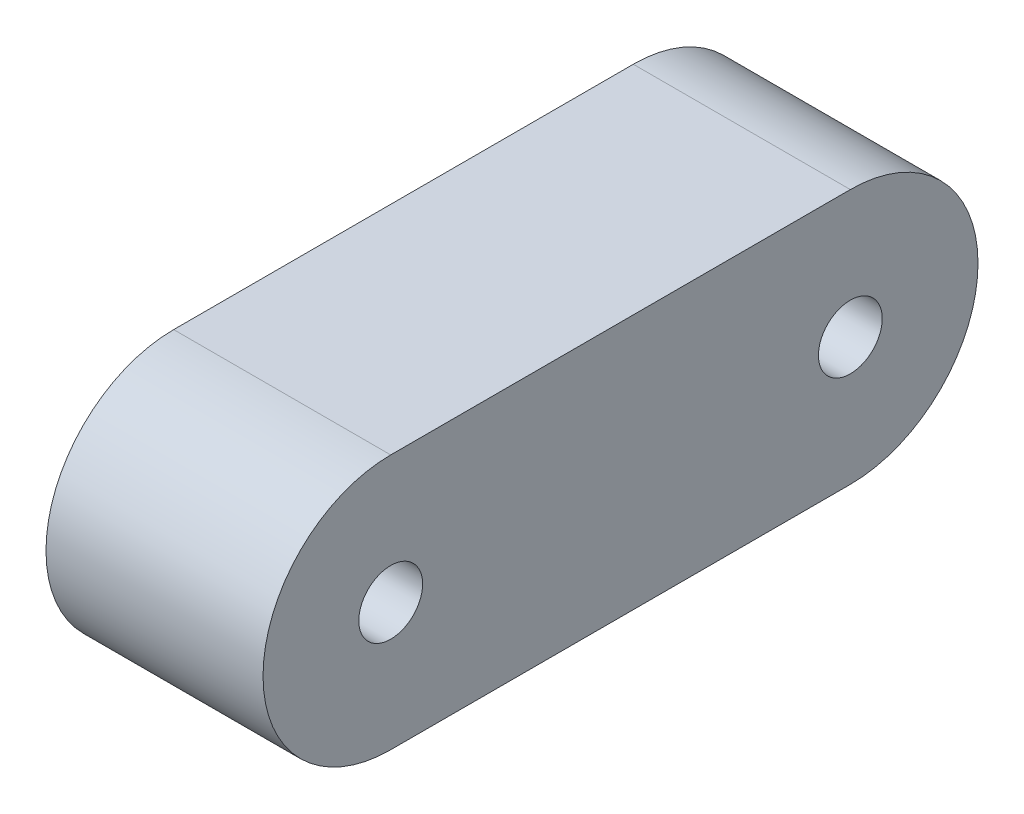
ISO-10303-21;
HEADER;
FILE_DESCRIPTION(('STEP AP214'),'2;1');
FILE_NAME('part.step','',(''),(''),'','','');
FILE_SCHEMA(('AUTOMOTIVE_DESIGN { 1 0 10303 214 1 1 1 1 }'));
ENDSEC;
DATA;
#1=APPLICATION_CONTEXT('core data for automotive mechanical design processes');
#2=APPLICATION_PROTOCOL_DEFINITION('international standard','automotive_design',2000,#1);
#3=PRODUCT_CONTEXT('',#1,'mechanical');
#4=PRODUCT('Part','Part','',(#3));
#5=PRODUCT_RELATED_PRODUCT_CATEGORY('part','',(#4));
#6=PRODUCT_DEFINITION_FORMATION('','',#4);
#7=PRODUCT_DEFINITION_CONTEXT('part definition',#1,'design');
#8=PRODUCT_DEFINITION('design','',#6,#7);
#9=PRODUCT_DEFINITION_SHAPE('','',#8);
#10=(LENGTH_UNIT() NAMED_UNIT(*) SI_UNIT(.MILLI.,.METRE.));
#11=(NAMED_UNIT(*) PLANE_ANGLE_UNIT() SI_UNIT($,.RADIAN.));
#12=(NAMED_UNIT(*) SI_UNIT($,.STERADIAN.) SOLID_ANGLE_UNIT());
#13=UNCERTAINTY_MEASURE_WITH_UNIT(LENGTH_MEASURE(1.E-05),#10,'distance_accuracy_value','');
#14=(GEOMETRIC_REPRESENTATION_CONTEXT(3) GLOBAL_UNCERTAINTY_ASSIGNED_CONTEXT((#13)) GLOBAL_UNIT_ASSIGNED_CONTEXT((#10,
#11,#12)) REPRESENTATION_CONTEXT('',''));
#15=CARTESIAN_POINT('',(0.,0.,0.));
#16=DIRECTION('',(0.,0.,1.));
#17=DIRECTION('',(1.,0.,0.));
#18=AXIS2_PLACEMENT_3D('',#15,#16,#17);
#19=CARTESIAN_POINT('',(8.5,0.,18.));
#20=DIRECTION('',(1.,0.,0.));
#21=DIRECTION('',(0.,0.,-1.));
#22=AXIS2_PLACEMENT_3D('',#19,#20,#21);
#23=PLANE('',#22);
#24=CARTESIAN_POINT('',(8.5,0.,18.));
#25=DIRECTION('',(1.,0.,0.));
#26=DIRECTION('',(0.,0.,-1.));
#27=AXIS2_PLACEMENT_3D('',#24,#25,#26);
#28=CIRCLE('',#27,2.5);
#29=CARTESIAN_POINT('',(8.5,0.,15.5));
#30=VERTEX_POINT('',#29);
#31=EDGE_CURVE('E100',#30,#30,#28,.T.);
#32=ORIENTED_EDGE('',*,*,#31,.F.);
#33=EDGE_LOOP('',(#32));
#34=FACE_BOUND('',#33,.T.);
#35=CARTESIAN_POINT('',(8.5,0.,18.));
#36=DIRECTION('',(1.,0.,0.));
#37=DIRECTION('',(0.,0.,-1.));
#38=AXIS2_PLACEMENT_3D('',#35,#36,#37);
#39=CIRCLE('',#38,9.99999999999999);
#40=CARTESIAN_POINT('',(8.5,9.99999999999998,18.));
#41=VERTEX_POINT('',#40);
#42=CARTESIAN_POINT('',(8.5,-9.99999999999999,18.));
#43=VERTEX_POINT('',#42);
#44=EDGE_CURVE('E85',#41,#43,#39,.T.);
#45=ORIENTED_EDGE('',*,*,#44,.T.);
#46=DIRECTION('',(0.,0.,-1.));
#47=VECTOR('',#46,1.);
#48=CARTESIAN_POINT('',(8.5,-9.99999999999999,18.));
#49=LINE('',#48,#47);
#50=CARTESIAN_POINT('',(8.5,-9.99999999999998,-18.));
#51=VERTEX_POINT('',#50);
#52=EDGE_CURVE('E80',#43,#51,#49,.T.);
#53=ORIENTED_EDGE('',*,*,#52,.T.);
#54=CARTESIAN_POINT('',(8.5,0.,-18.));
#55=DIRECTION('',(1.,0.,0.));
#56=DIRECTION('',(0.,0.,-1.));
#57=AXIS2_PLACEMENT_3D('',#54,#55,#56);
#58=CIRCLE('',#57,9.99999999999999);
#59=CARTESIAN_POINT('',(8.5,9.99999999999999,-18.));
#60=VERTEX_POINT('',#59);
#61=EDGE_CURVE('E83',#51,#60,#58,.T.);
#62=ORIENTED_EDGE('',*,*,#61,.T.);
#63=DIRECTION('',(0.,0.,1.));
#64=VECTOR('',#63,1.);
#65=CARTESIAN_POINT('',(8.5,9.99999999999998,18.));
#66=LINE('',#65,#64);
#67=EDGE_CURVE('E50',#60,#41,#66,.T.);
#68=ORIENTED_EDGE('',*,*,#67,.T.);
#69=EDGE_LOOP('',(#45,#53,#62,#68));
#70=FACE_BOUND('',#69,.T.);
#71=CARTESIAN_POINT('',(8.5,0.,-18.));
#72=DIRECTION('',(1.,0.,0.));
#73=DIRECTION('',(0.,0.,-1.));
#74=AXIS2_PLACEMENT_3D('',#71,#72,#73);
#75=CIRCLE('',#74,2.5);
#76=CARTESIAN_POINT('',(8.5,0.,-20.5));
#77=VERTEX_POINT('',#76);
#78=EDGE_CURVE('E115',#77,#77,#75,.T.);
#79=ORIENTED_EDGE('',*,*,#78,.F.);
#80=EDGE_LOOP('',(#79));
#81=FACE_BOUND('',#80,.T.);
#82=ADVANCED_FACE('F33',(#34,#70,#81),#23,.T.);
#83=CARTESIAN_POINT('',(-8.5,0.,18.));
#84=DIRECTION('',(1.,0.,0.));
#85=DIRECTION('',(0.,0.,-1.));
#86=AXIS2_PLACEMENT_3D('',#83,#84,#85);
#87=PLANE('',#86);
#88=CARTESIAN_POINT('',(-8.5,0.,18.));
#89=DIRECTION('',(1.,0.,0.));
#90=DIRECTION('',(0.,0.,-1.));
#91=AXIS2_PLACEMENT_3D('',#88,#89,#90);
#92=CIRCLE('',#91,9.99999999999999);
#93=CARTESIAN_POINT('',(-8.5,9.99999999999998,18.));
#94=VERTEX_POINT('',#93);
#95=CARTESIAN_POINT('',(-8.5,-9.99999999999999,18.));
#96=VERTEX_POINT('',#95);
#97=EDGE_CURVE('E97',#94,#96,#92,.T.);
#98=ORIENTED_EDGE('',*,*,#97,.F.);
#99=DIRECTION('',(0.,0.,1.));
#100=VECTOR('',#99,1.);
#101=CARTESIAN_POINT('',(-8.5,9.99999999999998,18.));
#102=LINE('',#101,#100);
#103=CARTESIAN_POINT('',(-8.5,9.99999999999999,-18.));
#104=VERTEX_POINT('',#103);
#105=EDGE_CURVE('E73',#104,#94,#102,.T.);
#106=ORIENTED_EDGE('',*,*,#105,.F.);
#107=CARTESIAN_POINT('',(-8.5,0.,-18.));
#108=DIRECTION('',(1.,0.,0.));
#109=DIRECTION('',(0.,0.,-1.));
#110=AXIS2_PLACEMENT_3D('',#107,#108,#109);
#111=CIRCLE('',#110,9.99999999999999);
#112=CARTESIAN_POINT('',(-8.5,-9.99999999999998,-18.));
#113=VERTEX_POINT('',#112);
#114=EDGE_CURVE('E67',#113,#104,#111,.T.);
#115=ORIENTED_EDGE('',*,*,#114,.F.);
#116=DIRECTION('',(0.,0.,-1.));
#117=VECTOR('',#116,1.);
#118=CARTESIAN_POINT('',(-8.5,-9.99999999999999,18.));
#119=LINE('',#118,#117);
#120=EDGE_CURVE('E89',#96,#113,#119,.T.);
#121=ORIENTED_EDGE('',*,*,#120,.F.);
#122=EDGE_LOOP('',(#98,#106,#115,#121));
#123=FACE_BOUND('',#122,.T.);
#124=CARTESIAN_POINT('',(-8.5,0.,18.));
#125=DIRECTION('',(1.,0.,0.));
#126=DIRECTION('',(0.,0.,-1.));
#127=AXIS2_PLACEMENT_3D('',#124,#125,#126);
#128=CIRCLE('',#127,2.5);
#129=CARTESIAN_POINT('',(-8.5,0.,15.5));
#130=VERTEX_POINT('',#129);
#131=EDGE_CURVE('E112',#130,#130,#128,.T.);
#132=ORIENTED_EDGE('',*,*,#131,.T.);
#133=EDGE_LOOP('',(#132));
#134=FACE_BOUND('',#133,.T.);
#135=CARTESIAN_POINT('',(-8.5,0.,-18.));
#136=DIRECTION('',(1.,0.,0.));
#137=DIRECTION('',(0.,0.,-1.));
#138=AXIS2_PLACEMENT_3D('',#135,#136,#137);
#139=CIRCLE('',#138,2.5);
#140=CARTESIAN_POINT('',(-8.5,0.,-20.5));
#141=VERTEX_POINT('',#140);
#142=EDGE_CURVE('E118',#141,#141,#139,.T.);
#143=ORIENTED_EDGE('',*,*,#142,.T.);
#144=EDGE_LOOP('',(#143));
#145=FACE_BOUND('',#144,.T.);
#146=ADVANCED_FACE('F108',(#123,#134,#145),#87,.F.);
#147=CARTESIAN_POINT('',(8.5,0.,18.));
#148=DIRECTION('',(-1.,0.,0.));
#149=DIRECTION('',(0.,0.,1.));
#150=AXIS2_PLACEMENT_3D('',#147,#148,#149);
#151=CYLINDRICAL_SURFACE('',#150,9.99999999999999);
#152=ORIENTED_EDGE('',*,*,#97,.T.);
#153=DIRECTION('',(-1.,0.,0.));
#154=VECTOR('',#153,1.);
#155=CARTESIAN_POINT('',(8.5,-9.99999999999999,18.));
#156=LINE('',#155,#154);
#157=EDGE_CURVE('E11',#43,#96,#156,.T.);
#158=ORIENTED_EDGE('',*,*,#157,.F.);
#159=ORIENTED_EDGE('',*,*,#44,.F.);
#160=DIRECTION('',(-1.,0.,0.));
#161=VECTOR('',#160,1.);
#162=CARTESIAN_POINT('',(8.5,9.99999999999998,18.));
#163=LINE('',#162,#161);
#164=EDGE_CURVE('E93',#41,#94,#163,.T.);
#165=ORIENTED_EDGE('',*,*,#164,.T.);
#166=EDGE_LOOP('',(#152,#158,#159,#165));
#167=FACE_BOUND('',#166,.T.);
#168=ADVANCED_FACE('F35',(#167),#151,.T.);
#169=CARTESIAN_POINT('',(8.5,-9.99999999999999,18.));
#170=DIRECTION('',(0.,1.,0.));
#171=DIRECTION('',(0.,0.,1.));
#172=AXIS2_PLACEMENT_3D('',#169,#170,#171);
#173=PLANE('',#172);
#174=ORIENTED_EDGE('',*,*,#120,.T.);
#175=DIRECTION('',(-1.,0.,0.));
#176=VECTOR('',#175,1.);
#177=CARTESIAN_POINT('',(8.5,-9.99999999999998,-18.));
#178=LINE('',#177,#176);
#179=EDGE_CURVE('E42',#51,#113,#178,.T.);
#180=ORIENTED_EDGE('',*,*,#179,.F.);
#181=ORIENTED_EDGE('',*,*,#52,.F.);
#182=ORIENTED_EDGE('',*,*,#157,.T.);
#183=EDGE_LOOP('',(#174,#180,#181,#182));
#184=FACE_BOUND('',#183,.T.);
#185=ADVANCED_FACE('F88',(#184),#173,.F.);
#186=CARTESIAN_POINT('',(8.5,0.,-18.));
#187=DIRECTION('',(-1.,0.,0.));
#188=DIRECTION('',(0.,0.,1.));
#189=AXIS2_PLACEMENT_3D('',#186,#187,#188);
#190=CYLINDRICAL_SURFACE('',#189,9.99999999999999);
#191=ORIENTED_EDGE('',*,*,#114,.T.);
#192=DIRECTION('',(-1.,0.,0.));
#193=VECTOR('',#192,1.);
#194=CARTESIAN_POINT('',(8.5,9.99999999999999,-18.));
#195=LINE('',#194,#193);
#196=EDGE_CURVE('E90',#60,#104,#195,.T.);
#197=ORIENTED_EDGE('',*,*,#196,.F.);
#198=ORIENTED_EDGE('',*,*,#61,.F.);
#199=ORIENTED_EDGE('',*,*,#179,.T.);
#200=EDGE_LOOP('',(#191,#197,#198,#199));
#201=FACE_BOUND('',#200,.T.);
#202=ADVANCED_FACE('F91',(#201),#190,.T.);
#203=CARTESIAN_POINT('',(8.5,9.99999999999998,18.));
#204=DIRECTION('',(0.,-1.,0.));
#205=DIRECTION('',(0.,0.,-1.));
#206=AXIS2_PLACEMENT_3D('',#203,#204,#205);
#207=PLANE('',#206);
#208=ORIENTED_EDGE('',*,*,#105,.T.);
#209=ORIENTED_EDGE('',*,*,#164,.F.);
#210=ORIENTED_EDGE('',*,*,#67,.F.);
#211=ORIENTED_EDGE('',*,*,#196,.T.);
#212=EDGE_LOOP('',(#208,#209,#210,#211));
#213=FACE_BOUND('',#212,.T.);
#214=ADVANCED_FACE('F105',(#213),#207,.F.);
#215=CARTESIAN_POINT('',(8.5,0.,18.));
#216=DIRECTION('',(-1.,0.,0.));
#217=DIRECTION('',(0.,0.,1.));
#218=AXIS2_PLACEMENT_3D('',#215,#216,#217);
#219=CYLINDRICAL_SURFACE('',#218,2.5);
#220=ORIENTED_EDGE('',*,*,#31,.T.);
#221=EDGE_LOOP('',(#220));
#222=FACE_BOUND('',#221,.T.);
#223=ORIENTED_EDGE('',*,*,#131,.F.);
#224=EDGE_LOOP('',(#223));
#225=FACE_BOUND('',#224,.T.);
#226=ADVANCED_FACE('F135',(#222,#225),#219,.F.);
#227=CARTESIAN_POINT('',(8.5,0.,-18.));
#228=DIRECTION('',(-1.,0.,0.));
#229=DIRECTION('',(0.,0.,1.));
#230=AXIS2_PLACEMENT_3D('',#227,#228,#229);
#231=CYLINDRICAL_SURFACE('',#230,2.5);
#232=ORIENTED_EDGE('',*,*,#78,.T.);
#233=EDGE_LOOP('',(#232));
#234=FACE_BOUND('',#233,.T.);
#235=ORIENTED_EDGE('',*,*,#142,.F.);
#236=EDGE_LOOP('',(#235));
#237=FACE_BOUND('',#236,.T.);
#238=ADVANCED_FACE('F124',(#234,#237),#231,.F.);
#239=CLOSED_SHELL('',(#82,#146,#168,#185,#202,#214,#226,#238));
#240=MANIFOLD_SOLID_BREP('B2',#239);
#241=ADVANCED_BREP_SHAPE_REPRESENTATION('',(#18,#240),#14);
#242=SHAPE_DEFINITION_REPRESENTATION(#9,#241);
ENDSEC;
END-ISO-10303-21;
